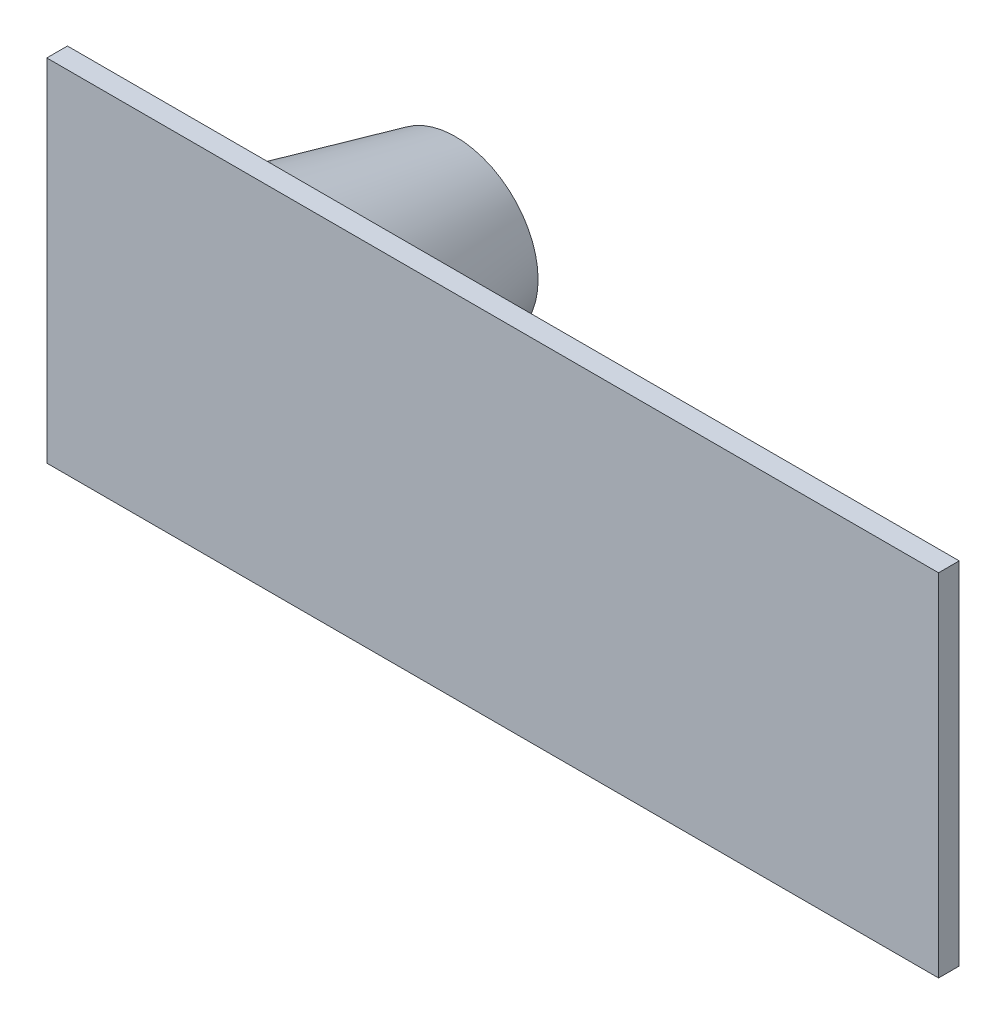
ISO-10303-21;
HEADER;
FILE_DESCRIPTION(('STEP AP214'),'2;1');
FILE_NAME('part.step','',(''),(''),'','','');
FILE_SCHEMA(('AUTOMOTIVE_DESIGN { 1 0 10303 214 1 1 1 1 }'));
ENDSEC;
DATA;
#1=APPLICATION_CONTEXT('core data for automotive mechanical design processes');
#2=APPLICATION_PROTOCOL_DEFINITION('international standard','automotive_design',2000,#1);
#3=PRODUCT_CONTEXT('',#1,'mechanical');
#4=PRODUCT('Part','Part','',(#3));
#5=PRODUCT_RELATED_PRODUCT_CATEGORY('part','',(#4));
#6=PRODUCT_DEFINITION_FORMATION('','',#4);
#7=PRODUCT_DEFINITION_CONTEXT('part definition',#1,'design');
#8=PRODUCT_DEFINITION('design','',#6,#7);
#9=PRODUCT_DEFINITION_SHAPE('','',#8);
#10=(LENGTH_UNIT() NAMED_UNIT(*) SI_UNIT(.MILLI.,.METRE.));
#11=(NAMED_UNIT(*) PLANE_ANGLE_UNIT() SI_UNIT($,.RADIAN.));
#12=(NAMED_UNIT(*) SI_UNIT($,.STERADIAN.) SOLID_ANGLE_UNIT());
#13=UNCERTAINTY_MEASURE_WITH_UNIT(LENGTH_MEASURE(1.E-05),#10,'distance_accuracy_value','');
#14=(GEOMETRIC_REPRESENTATION_CONTEXT(3) GLOBAL_UNCERTAINTY_ASSIGNED_CONTEXT((#13)) GLOBAL_UNIT_ASSIGNED_CONTEXT((#10,
#11,#12)) REPRESENTATION_CONTEXT('',''));
#15=CARTESIAN_POINT('',(0.,0.,0.));
#16=DIRECTION('',(0.,0.,1.));
#17=DIRECTION('',(1.,0.,0.));
#18=AXIS2_PLACEMENT_3D('',#15,#16,#17);
#19=CARTESIAN_POINT('',(9.2,10.45,-15.15));
#20=DIRECTION('',(1.,0.,0.));
#21=DIRECTION('',(0.,0.,-1.));
#22=AXIS2_PLACEMENT_3D('',#19,#20,#21);
#23=PLANE('',#22);
#24=DIRECTION('',(0.,0.,1.));
#25=VECTOR('',#24,1.);
#26=CARTESIAN_POINT('',(9.2,1.95,-15.15));
#27=LINE('',#26,#25);
#28=CARTESIAN_POINT('',(9.2,1.95,-15.15));
#29=VERTEX_POINT('',#28);
#30=CARTESIAN_POINT('',(9.2,1.95,-14.65));
#31=VERTEX_POINT('',#30);
#32=EDGE_CURVE('E104',#29,#31,#27,.T.);
#33=ORIENTED_EDGE('',*,*,#32,.T.);
#34=DIRECTION('',(0.,-1.,0.));
#35=VECTOR('',#34,1.);
#36=CARTESIAN_POINT('',(9.2,10.45,-14.65));
#37=LINE('',#36,#35);
#38=CARTESIAN_POINT('',(9.2,10.45,-14.65));
#39=VERTEX_POINT('',#38);
#40=EDGE_CURVE('E11',#39,#31,#37,.T.);
#41=ORIENTED_EDGE('',*,*,#40,.F.);
#42=DIRECTION('',(0.,0.,1.));
#43=VECTOR('',#42,1.);
#44=CARTESIAN_POINT('',(9.2,10.45,-15.15));
#45=LINE('',#44,#43);
#46=CARTESIAN_POINT('',(9.2,10.45,-15.15));
#47=VERTEX_POINT('',#46);
#48=EDGE_CURVE('E92',#47,#39,#45,.T.);
#49=ORIENTED_EDGE('',*,*,#48,.F.);
#50=DIRECTION('',(0.,-1.,0.));
#51=VECTOR('',#50,1.);
#52=CARTESIAN_POINT('',(9.2,10.45,-15.15));
#53=LINE('',#52,#51);
#54=EDGE_CURVE('E100',#47,#29,#53,.T.);
#55=ORIENTED_EDGE('',*,*,#54,.T.);
#56=EDGE_LOOP('',(#33,#41,#49,#55));
#57=FACE_BOUND('',#56,.T.);
#58=ADVANCED_FACE('F41',(#57),#23,.F.);
#59=CARTESIAN_POINT('',(9.2,10.45,-14.65));
#60=DIRECTION('',(0.,0.,-1.));
#61=DIRECTION('',(-1.,0.,0.));
#62=AXIS2_PLACEMENT_3D('',#59,#60,#61);
#63=PLANE('',#62);
#64=DIRECTION('',(1.,0.,0.));
#65=VECTOR('',#64,1.);
#66=CARTESIAN_POINT('',(9.2,1.95,-14.65));
#67=LINE('',#66,#65);
#68=CARTESIAN_POINT('',(30.8,1.95,-14.65));
#69=VERTEX_POINT('',#68);
#70=EDGE_CURVE('E96',#31,#69,#67,.T.);
#71=ORIENTED_EDGE('',*,*,#70,.T.);
#72=DIRECTION('',(0.,-1.,0.));
#73=VECTOR('',#72,1.);
#74=CARTESIAN_POINT('',(30.8,10.45,-14.65));
#75=LINE('',#74,#73);
#76=CARTESIAN_POINT('',(30.8,10.45,-14.65));
#77=VERTEX_POINT('',#76);
#78=EDGE_CURVE('E49',#77,#69,#75,.T.);
#79=ORIENTED_EDGE('',*,*,#78,.F.);
#80=DIRECTION('',(1.,0.,0.));
#81=VECTOR('',#80,1.);
#82=CARTESIAN_POINT('',(9.2,10.45,-14.65));
#83=LINE('',#82,#81);
#84=EDGE_CURVE('E87',#39,#77,#83,.T.);
#85=ORIENTED_EDGE('',*,*,#84,.F.);
#86=ORIENTED_EDGE('',*,*,#40,.T.);
#87=EDGE_LOOP('',(#71,#79,#85,#86));
#88=FACE_BOUND('',#87,.T.);
#89=ADVANCED_FACE('F95',(#88),#63,.F.);
#90=CARTESIAN_POINT('',(30.8,10.45,-14.65));
#91=DIRECTION('',(-1.,0.,0.));
#92=DIRECTION('',(0.,0.,1.));
#93=AXIS2_PLACEMENT_3D('',#90,#91,#92);
#94=PLANE('',#93);
#95=DIRECTION('',(0.,0.,-1.));
#96=VECTOR('',#95,1.);
#97=CARTESIAN_POINT('',(30.8,1.95,-14.65));
#98=LINE('',#97,#96);
#99=CARTESIAN_POINT('',(30.8,1.95,-15.15));
#100=VERTEX_POINT('',#99);
#101=EDGE_CURVE('E74',#69,#100,#98,.T.);
#102=ORIENTED_EDGE('',*,*,#101,.T.);
#103=DIRECTION('',(0.,-1.,0.));
#104=VECTOR('',#103,1.);
#105=CARTESIAN_POINT('',(30.8,10.45,-15.15));
#106=LINE('',#105,#104);
#107=CARTESIAN_POINT('',(30.8,10.45,-15.15));
#108=VERTEX_POINT('',#107);
#109=EDGE_CURVE('E97',#108,#100,#106,.T.);
#110=ORIENTED_EDGE('',*,*,#109,.F.);
#111=DIRECTION('',(0.,0.,-1.));
#112=VECTOR('',#111,1.);
#113=CARTESIAN_POINT('',(30.8,10.45,-14.65));
#114=LINE('',#113,#112);
#115=EDGE_CURVE('E90',#77,#108,#114,.T.);
#116=ORIENTED_EDGE('',*,*,#115,.F.);
#117=ORIENTED_EDGE('',*,*,#78,.T.);
#118=EDGE_LOOP('',(#102,#110,#116,#117));
#119=FACE_BOUND('',#118,.T.);
#120=ADVANCED_FACE('F98',(#119),#94,.F.);
#121=CARTESIAN_POINT('',(30.8,10.45,-15.15));
#122=DIRECTION('',(0.,0.,1.));
#123=DIRECTION('',(1.,0.,0.));
#124=AXIS2_PLACEMENT_3D('',#121,#122,#123);
#125=PLANE('',#124);
#126=CARTESIAN_POINT('',(25.7,6.95,-15.15));
#127=DIRECTION('',(0.,0.,1.));
#128=DIRECTION('',(1.,0.,0.));
#129=AXIS2_PLACEMENT_3D('',#126,#127,#128);
#130=CIRCLE('',#129,2.5);
#131=CARTESIAN_POINT('',(28.2,6.95,-15.15));
#132=VERTEX_POINT('',#131);
#133=EDGE_CURVE('E129',#132,#132,#130,.T.);
#134=ORIENTED_EDGE('',*,*,#133,.T.);
#135=EDGE_LOOP('',(#134));
#136=FACE_BOUND('',#135,.T.);
#137=CARTESIAN_POINT('',(14.3,6.95,-15.15));
#138=DIRECTION('',(0.,0.,1.));
#139=DIRECTION('',(1.,0.,0.));
#140=AXIS2_PLACEMENT_3D('',#137,#138,#139);
#141=CIRCLE('',#140,3.);
#142=CARTESIAN_POINT('',(17.3,6.95,-15.15));
#143=VERTEX_POINT('',#142);
#144=EDGE_CURVE('E120',#143,#143,#141,.T.);
#145=ORIENTED_EDGE('',*,*,#144,.T.);
#146=EDGE_LOOP('',(#145));
#147=FACE_BOUND('',#146,.T.);
#148=DIRECTION('',(-1.,0.,0.));
#149=VECTOR('',#148,1.);
#150=CARTESIAN_POINT('',(30.8,1.95,-15.15));
#151=LINE('',#150,#149);
#152=EDGE_CURVE('E80',#100,#29,#151,.T.);
#153=ORIENTED_EDGE('',*,*,#152,.T.);
#154=ORIENTED_EDGE('',*,*,#54,.F.);
#155=DIRECTION('',(-1.,0.,0.));
#156=VECTOR('',#155,1.);
#157=CARTESIAN_POINT('',(30.8,10.45,-15.15));
#158=LINE('',#157,#156);
#159=EDGE_CURVE('E57',#108,#47,#158,.T.);
#160=ORIENTED_EDGE('',*,*,#159,.F.);
#161=ORIENTED_EDGE('',*,*,#109,.T.);
#162=EDGE_LOOP('',(#153,#154,#160,#161));
#163=FACE_BOUND('',#162,.T.);
#164=ADVANCED_FACE('F112',(#136,#147,#163),#125,.F.);
#165=CARTESIAN_POINT('',(0.,10.45,0.));
#166=DIRECTION('',(0.,1.,0.));
#167=DIRECTION('',(0.,0.,1.));
#168=AXIS2_PLACEMENT_3D('',#165,#166,#167);
#169=PLANE('',#168);
#170=ORIENTED_EDGE('',*,*,#48,.T.);
#171=ORIENTED_EDGE('',*,*,#84,.T.);
#172=ORIENTED_EDGE('',*,*,#115,.T.);
#173=ORIENTED_EDGE('',*,*,#159,.T.);
#174=EDGE_LOOP('',(#170,#171,#172,#173));
#175=FACE_BOUND('',#174,.T.);
#176=ADVANCED_FACE('F88',(#175),#169,.T.);
#177=CARTESIAN_POINT('',(0.,1.95,0.));
#178=DIRECTION('',(0.,1.,0.));
#179=DIRECTION('',(0.,0.,1.));
#180=AXIS2_PLACEMENT_3D('',#177,#178,#179);
#181=PLANE('',#180);
#182=ORIENTED_EDGE('',*,*,#32,.F.);
#183=ORIENTED_EDGE('',*,*,#152,.F.);
#184=ORIENTED_EDGE('',*,*,#101,.F.);
#185=ORIENTED_EDGE('',*,*,#70,.F.);
#186=EDGE_LOOP('',(#182,#183,#184,#185));
#187=FACE_BOUND('',#186,.T.);
#188=ADVANCED_FACE('F115',(#187),#181,.F.);
#189=CARTESIAN_POINT('',(14.3,6.95,-19.45));
#190=DIRECTION('',(0.,0.,1.));
#191=DIRECTION('',(1.,0.,0.));
#192=AXIS2_PLACEMENT_3D('',#189,#190,#191);
#193=CONICAL_SURFACE('',#192,1.5,0.228496639291863);
#194=CARTESIAN_POINT('',(14.3,6.95,-15.15));
#195=DIRECTION('',(0.,0.,1.));
#196=DIRECTION('',(1.,0.,0.));
#197=AXIS2_PLACEMENT_3D('',#194,#195,#196);
#198=CIRCLE('',#197,2.5);
#199=CARTESIAN_POINT('',(16.8,6.95,-15.15));
#200=VERTEX_POINT('',#199);
#201=EDGE_CURVE('E107',#200,#200,#198,.T.);
#202=ORIENTED_EDGE('',*,*,#201,.T.);
#203=EDGE_LOOP('',(#202));
#204=FACE_BOUND('',#203,.T.);
#205=CARTESIAN_POINT('',(14.3,6.95,-19.45));
#206=DIRECTION('',(0.,0.,1.));
#207=DIRECTION('',(1.,0.,0.));
#208=AXIS2_PLACEMENT_3D('',#205,#206,#207);
#209=CIRCLE('',#208,1.5);
#210=CARTESIAN_POINT('',(15.8,6.95,-19.45));
#211=VERTEX_POINT('',#210);
#212=EDGE_CURVE('E126',#211,#211,#209,.T.);
#213=ORIENTED_EDGE('',*,*,#212,.F.);
#214=EDGE_LOOP('',(#213));
#215=FACE_BOUND('',#214,.T.);
#216=ADVANCED_FACE('F158',(#204,#215),#193,.F.);
#217=CARTESIAN_POINT('',(14.3,6.95,-15.15));
#218=DIRECTION('',(0.,0.,1.));
#219=DIRECTION('',(1.,0.,0.));
#220=AXIS2_PLACEMENT_3D('',#217,#218,#219);
#221=CONICAL_SURFACE('',#220,3.,0.228496639291862);
#222=CARTESIAN_POINT('',(14.3,6.95,-19.45));
#223=DIRECTION('',(0.,0.,1.));
#224=DIRECTION('',(1.,0.,0.));
#225=AXIS2_PLACEMENT_3D('',#222,#223,#224);
#226=CIRCLE('',#225,2.);
#227=CARTESIAN_POINT('',(16.3,6.95,-19.45));
#228=VERTEX_POINT('',#227);
#229=EDGE_CURVE('E123',#228,#228,#226,.T.);
#230=ORIENTED_EDGE('',*,*,#229,.T.);
#231=EDGE_LOOP('',(#230));
#232=FACE_BOUND('',#231,.T.);
#233=ORIENTED_EDGE('',*,*,#144,.F.);
#234=EDGE_LOOP('',(#233));
#235=FACE_BOUND('',#234,.T.);
#236=ADVANCED_FACE('F163',(#232,#235),#221,.T.);
#237=CARTESIAN_POINT('',(16.3,6.95,-19.45));
#238=DIRECTION('',(0.,0.,-1.));
#239=DIRECTION('',(-1.,0.,0.));
#240=AXIS2_PLACEMENT_3D('',#237,#238,#239);
#241=PLANE('',#240);
#242=ORIENTED_EDGE('',*,*,#212,.T.);
#243=EDGE_LOOP('',(#242));
#244=FACE_BOUND('',#243,.T.);
#245=ORIENTED_EDGE('',*,*,#229,.F.);
#246=EDGE_LOOP('',(#245));
#247=FACE_BOUND('',#246,.T.);
#248=ADVANCED_FACE('F143',(#244,#247),#241,.T.);
#249=ORIENTED_EDGE('',*,*,#201,.F.);
#250=EDGE_LOOP('',(#249));
#251=FACE_BOUND('',#250,.T.);
#252=ADVANCED_FACE('F137',(#251),#125,.F.);
#253=CARTESIAN_POINT('',(25.7,6.95,-12.1277777777778));
#254=DIRECTION('',(0.,0.,1.));
#255=DIRECTION('',(1.,0.,0.));
#256=AXIS2_PLACEMENT_3D('',#253,#254,#255);
#257=SPHERICAL_SURFACE('',#256,3.92222222222224);
#258=ORIENTED_EDGE('',*,*,#133,.F.);
#259=EDGE_LOOP('',(#258));
#260=FACE_BOUND('',#259,.T.);
#261=ADVANCED_FACE('F135',(#260),#257,.T.);
#262=CLOSED_SHELL('',(#58,#89,#120,#164,#176,#188,#216,#236,#248,#252,#261));
#263=MANIFOLD_SOLID_BREP('B2',#262);
#264=ADVANCED_BREP_SHAPE_REPRESENTATION('',(#18,#263),#14);
#265=SHAPE_DEFINITION_REPRESENTATION(#9,#264);
ENDSEC;
END-ISO-10303-21;
